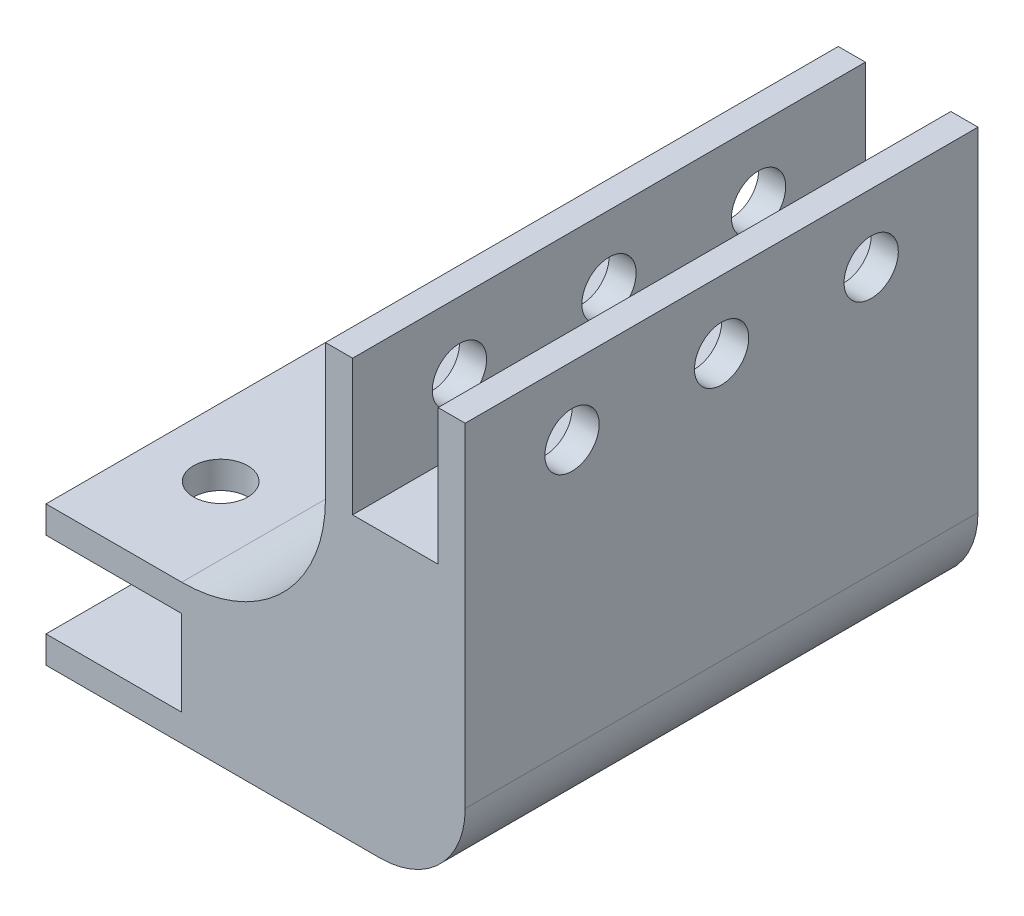
ISO-10303-21;
HEADER;
FILE_DESCRIPTION(('STEP AP214'),'2;1');
FILE_NAME('part.step','',(''),(''),'','','');
FILE_SCHEMA(('AUTOMOTIVE_DESIGN { 1 0 10303 214 1 1 1 1 }'));
ENDSEC;
DATA;
#1=APPLICATION_CONTEXT('core data for automotive mechanical design processes');
#2=APPLICATION_PROTOCOL_DEFINITION('international standard','automotive_design',2000,#1);
#3=PRODUCT_CONTEXT('',#1,'mechanical');
#4=PRODUCT('Part','Part','',(#3));
#5=PRODUCT_RELATED_PRODUCT_CATEGORY('part','',(#4));
#6=PRODUCT_DEFINITION_FORMATION('','',#4);
#7=PRODUCT_DEFINITION_CONTEXT('part definition',#1,'design');
#8=PRODUCT_DEFINITION('design','',#6,#7);
#9=PRODUCT_DEFINITION_SHAPE('','',#8);
#10=(LENGTH_UNIT() NAMED_UNIT(*) SI_UNIT(.MILLI.,.METRE.));
#11=(NAMED_UNIT(*) PLANE_ANGLE_UNIT() SI_UNIT($,.RADIAN.));
#12=(NAMED_UNIT(*) SI_UNIT($,.STERADIAN.) SOLID_ANGLE_UNIT());
#13=UNCERTAINTY_MEASURE_WITH_UNIT(LENGTH_MEASURE(1.E-05),#10,'distance_accuracy_value','');
#14=(GEOMETRIC_REPRESENTATION_CONTEXT(3) GLOBAL_UNCERTAINTY_ASSIGNED_CONTEXT((#13)) GLOBAL_UNIT_ASSIGNED_CONTEXT((#10,
#11,#12)) REPRESENTATION_CONTEXT('',''));
#15=CARTESIAN_POINT('',(0.,0.,0.));
#16=DIRECTION('',(0.,0.,1.));
#17=DIRECTION('',(1.,0.,0.));
#18=AXIS2_PLACEMENT_3D('',#15,#16,#17);
#19=CARTESIAN_POINT('',(150.,0.,60.));
#20=DIRECTION('',(0.,0.,-1.));
#21=DIRECTION('',(-1.,0.,0.));
#22=AXIS2_PLACEMENT_3D('',#19,#20,#21);
#23=PLANE('',#22);
#24=DIRECTION('',(1.,0.,0.));
#25=VECTOR('',#24,1.);
#26=CARTESIAN_POINT('',(104.125,-3.175,60.));
#27=LINE('',#26,#25);
#28=CARTESIAN_POINT('',(104.125,-3.175,60.));
#29=VERTEX_POINT('',#28);
#30=CARTESIAN_POINT('',(143.175,-3.175,60.));
#31=VERTEX_POINT('',#30);
#32=EDGE_CURVE('E212',#29,#31,#27,.T.);
#33=ORIENTED_EDGE('',*,*,#32,.T.);
#34=CARTESIAN_POINT('',(143.175,6.825,60.));
#35=DIRECTION('',(0.,0.,-1.));
#36=DIRECTION('',(-1.,0.,0.));
#37=AXIS2_PLACEMENT_3D('',#34,#35,#36);
#38=CIRCLE('',#37,10.);
#39=CARTESIAN_POINT('',(153.175,6.82500000000003,60.));
#40=VERTEX_POINT('',#39);
#41=EDGE_CURVE('E12',#31,#40,#38,.F.);
#42=ORIENTED_EDGE('',*,*,#41,.T.);
#43=DIRECTION('',(0.,1.,0.));
#44=VECTOR('',#43,1.);
#45=CARTESIAN_POINT('',(153.175,45.875,60.));
#46=LINE('',#45,#44);
#47=CARTESIAN_POINT('',(153.175,45.875,60.));
#48=VERTEX_POINT('',#47);
#49=EDGE_CURVE('E215',#40,#48,#46,.T.);
#50=ORIENTED_EDGE('',*,*,#49,.T.);
#51=DIRECTION('',(-1.,0.,0.));
#52=VECTOR('',#51,1.);
#53=CARTESIAN_POINT('',(150.,45.875,60.));
#54=LINE('',#53,#52);
#55=CARTESIAN_POINT('',(150.,45.875,60.));
#56=VERTEX_POINT('',#55);
#57=EDGE_CURVE('E189',#48,#56,#54,.T.);
#58=ORIENTED_EDGE('',*,*,#57,.T.);
#59=DIRECTION('',(0.,-1.,0.));
#60=VECTOR('',#59,1.);
#61=CARTESIAN_POINT('',(150.,30.,60.));
#62=LINE('',#61,#60);
#63=CARTESIAN_POINT('',(150.,30.,60.));
#64=VERTEX_POINT('',#63);
#65=EDGE_CURVE('E185',#56,#64,#62,.T.);
#66=ORIENTED_EDGE('',*,*,#65,.T.);
#67=DIRECTION('',(1.,0.,0.));
#68=VECTOR('',#67,1.);
#69=CARTESIAN_POINT('',(150.,30.,60.));
#70=LINE('',#69,#68);
#71=CARTESIAN_POINT('',(140.,30.,60.));
#72=VERTEX_POINT('',#71);
#73=EDGE_CURVE('E307',#72,#64,#70,.T.);
#74=ORIENTED_EDGE('',*,*,#73,.F.);
#75=DIRECTION('',(0.,1.,0.));
#76=VECTOR('',#75,1.);
#77=CARTESIAN_POINT('',(140.,45.875,60.));
#78=LINE('',#77,#76);
#79=CARTESIAN_POINT('',(140.,45.875,60.));
#80=VERTEX_POINT('',#79);
#81=EDGE_CURVE('E224',#72,#80,#78,.T.);
#82=ORIENTED_EDGE('',*,*,#81,.T.);
#83=DIRECTION('',(-1.,0.,0.));
#84=VECTOR('',#83,1.);
#85=CARTESIAN_POINT('',(136.825,45.875,60.));
#86=LINE('',#85,#84);
#87=CARTESIAN_POINT('',(136.825,45.875,60.));
#88=VERTEX_POINT('',#87);
#89=EDGE_CURVE('E263',#80,#88,#86,.T.);
#90=ORIENTED_EDGE('',*,*,#89,.T.);
#91=DIRECTION('',(0.,-1.,0.));
#92=VECTOR('',#91,1.);
#93=CARTESIAN_POINT('',(136.825,30.,60.));
#94=LINE('',#93,#92);
#95=CARTESIAN_POINT('',(136.825,30.,60.));
#96=VERTEX_POINT('',#95);
#97=EDGE_CURVE('E267',#88,#96,#94,.T.);
#98=ORIENTED_EDGE('',*,*,#97,.T.);
#99=CARTESIAN_POINT('',(120.,30.,60.));
#100=DIRECTION('',(0.,0.,-1.));
#101=DIRECTION('',(1.,0.,0.));
#102=AXIS2_PLACEMENT_3D('',#99,#100,#101);
#103=CIRCLE('',#102,16.825);
#104=CARTESIAN_POINT('',(120.,13.175,60.));
#105=VERTEX_POINT('',#104);
#106=EDGE_CURVE('E271',#96,#105,#103,.T.);
#107=ORIENTED_EDGE('',*,*,#106,.T.);
#108=DIRECTION('',(-1.,0.,0.));
#109=VECTOR('',#108,1.);
#110=CARTESIAN_POINT('',(120.,13.175,60.));
#111=LINE('',#110,#109);
#112=CARTESIAN_POINT('',(104.125,13.175,60.));
#113=VERTEX_POINT('',#112);
#114=EDGE_CURVE('E275',#105,#113,#111,.T.);
#115=ORIENTED_EDGE('',*,*,#114,.T.);
#116=DIRECTION('',(0.,-1.,0.));
#117=VECTOR('',#116,1.);
#118=CARTESIAN_POINT('',(104.125,13.175,60.));
#119=LINE('',#118,#117);
#120=CARTESIAN_POINT('',(104.125,10.,60.));
#121=VERTEX_POINT('',#120);
#122=EDGE_CURVE('E279',#113,#121,#119,.T.);
#123=ORIENTED_EDGE('',*,*,#122,.T.);
#124=DIRECTION('',(1.,0.,0.));
#125=VECTOR('',#124,1.);
#126=CARTESIAN_POINT('',(104.125,10.,60.));
#127=LINE('',#126,#125);
#128=CARTESIAN_POINT('',(120.,10.,60.));
#129=VERTEX_POINT('',#128);
#130=EDGE_CURVE('E236',#121,#129,#127,.T.);
#131=ORIENTED_EDGE('',*,*,#130,.T.);
#132=DIRECTION('',(0.,-1.,0.));
#133=VECTOR('',#132,1.);
#134=CARTESIAN_POINT('',(120.,0.,60.));
#135=LINE('',#134,#133);
#136=CARTESIAN_POINT('',(120.,0.,60.));
#137=VERTEX_POINT('',#136);
#138=EDGE_CURVE('E310',#129,#137,#135,.T.);
#139=ORIENTED_EDGE('',*,*,#138,.T.);
#140=DIRECTION('',(-1.,0.,0.));
#141=VECTOR('',#140,1.);
#142=CARTESIAN_POINT('',(120.,0.,60.));
#143=LINE('',#142,#141);
#144=CARTESIAN_POINT('',(104.125,0.,60.));
#145=VERTEX_POINT('',#144);
#146=EDGE_CURVE('E207',#137,#145,#143,.T.);
#147=ORIENTED_EDGE('',*,*,#146,.T.);
#148=DIRECTION('',(0.,-1.,0.));
#149=VECTOR('',#148,1.);
#150=CARTESIAN_POINT('',(104.125,0.,60.));
#151=LINE('',#150,#149);
#152=EDGE_CURVE('E165',#145,#29,#151,.T.);
#153=ORIENTED_EDGE('',*,*,#152,.T.);
#154=EDGE_LOOP('',(#33,#42,#50,#58,#66,#74,#82,#90,#98,#107,#115,#123,#131,#139,#147,#153));
#155=FACE_BOUND('',#154,.T.);
#156=ADVANCED_FACE('F46',(#155),#23,.F.);
#157=CARTESIAN_POINT('',(150.,0.,0.));
#158=DIRECTION('',(0.,0.,-1.));
#159=DIRECTION('',(-1.,0.,0.));
#160=AXIS2_PLACEMENT_3D('',#157,#158,#159);
#161=PLANE('',#160);
#162=DIRECTION('',(0.,1.,0.));
#163=VECTOR('',#162,1.);
#164=CARTESIAN_POINT('',(153.175,45.875,0.));
#165=LINE('',#164,#163);
#166=CARTESIAN_POINT('',(153.175,6.82500000000003,0.));
#167=VERTEX_POINT('',#166);
#168=CARTESIAN_POINT('',(153.175,45.875,0.));
#169=VERTEX_POINT('',#168);
#170=EDGE_CURVE('E197',#167,#169,#165,.T.);
#171=ORIENTED_EDGE('',*,*,#170,.F.);
#172=CARTESIAN_POINT('',(143.175,6.825,0.));
#173=DIRECTION('',(0.,0.,-1.));
#174=DIRECTION('',(-1.,0.,0.));
#175=AXIS2_PLACEMENT_3D('',#172,#173,#174);
#176=CIRCLE('',#175,10.);
#177=CARTESIAN_POINT('',(143.175,-3.175,0.));
#178=VERTEX_POINT('',#177);
#179=EDGE_CURVE('E69',#167,#178,#176,.T.);
#180=ORIENTED_EDGE('',*,*,#179,.T.);
#181=DIRECTION('',(1.,0.,0.));
#182=VECTOR('',#181,1.);
#183=CARTESIAN_POINT('',(104.125,-3.175,0.));
#184=LINE('',#183,#182);
#185=CARTESIAN_POINT('',(104.125,-3.175,0.));
#186=VERTEX_POINT('',#185);
#187=EDGE_CURVE('E178',#186,#178,#184,.T.);
#188=ORIENTED_EDGE('',*,*,#187,.F.);
#189=DIRECTION('',(0.,-1.,0.));
#190=VECTOR('',#189,1.);
#191=CARTESIAN_POINT('',(104.125,0.,0.));
#192=LINE('',#191,#190);
#193=CARTESIAN_POINT('',(104.125,0.,0.));
#194=VERTEX_POINT('',#193);
#195=EDGE_CURVE('E163',#194,#186,#192,.T.);
#196=ORIENTED_EDGE('',*,*,#195,.F.);
#197=DIRECTION('',(-1.,0.,0.));
#198=VECTOR('',#197,1.);
#199=CARTESIAN_POINT('',(120.,0.,0.));
#200=LINE('',#199,#198);
#201=CARTESIAN_POINT('',(120.,0.,0.));
#202=VERTEX_POINT('',#201);
#203=EDGE_CURVE('E177',#202,#194,#200,.T.);
#204=ORIENTED_EDGE('',*,*,#203,.F.);
#205=DIRECTION('',(0.,-1.,0.));
#206=VECTOR('',#205,1.);
#207=CARTESIAN_POINT('',(120.,0.,0.));
#208=LINE('',#207,#206);
#209=CARTESIAN_POINT('',(120.,10.,0.));
#210=VERTEX_POINT('',#209);
#211=EDGE_CURVE('E320',#210,#202,#208,.T.);
#212=ORIENTED_EDGE('',*,*,#211,.F.);
#213=DIRECTION('',(1.,0.,0.));
#214=VECTOR('',#213,1.);
#215=CARTESIAN_POINT('',(104.125,10.,0.));
#216=LINE('',#215,#214);
#217=CARTESIAN_POINT('',(104.125,10.,0.));
#218=VERTEX_POINT('',#217);
#219=EDGE_CURVE('E256',#218,#210,#216,.T.);
#220=ORIENTED_EDGE('',*,*,#219,.F.);
#221=DIRECTION('',(0.,-1.,0.));
#222=VECTOR('',#221,1.);
#223=CARTESIAN_POINT('',(104.125,13.175,0.));
#224=LINE('',#223,#222);
#225=CARTESIAN_POINT('',(104.125,13.175,0.));
#226=VERTEX_POINT('',#225);
#227=EDGE_CURVE('E252',#226,#218,#224,.T.);
#228=ORIENTED_EDGE('',*,*,#227,.F.);
#229=DIRECTION('',(-1.,0.,0.));
#230=VECTOR('',#229,1.);
#231=CARTESIAN_POINT('',(120.,13.175,0.));
#232=LINE('',#231,#230);
#233=CARTESIAN_POINT('',(120.,13.175,0.));
#234=VERTEX_POINT('',#233);
#235=EDGE_CURVE('E248',#234,#226,#232,.T.);
#236=ORIENTED_EDGE('',*,*,#235,.F.);
#237=CARTESIAN_POINT('',(120.,30.,0.));
#238=DIRECTION('',(0.,0.,-1.));
#239=DIRECTION('',(1.,0.,0.));
#240=AXIS2_PLACEMENT_3D('',#237,#238,#239);
#241=CIRCLE('',#240,16.825);
#242=CARTESIAN_POINT('',(136.825,30.,0.));
#243=VERTEX_POINT('',#242);
#244=EDGE_CURVE('E244',#243,#234,#241,.T.);
#245=ORIENTED_EDGE('',*,*,#244,.F.);
#246=DIRECTION('',(0.,-1.,0.));
#247=VECTOR('',#246,1.);
#248=CARTESIAN_POINT('',(136.825,30.,0.));
#249=LINE('',#248,#247);
#250=CARTESIAN_POINT('',(136.825,45.875,0.));
#251=VERTEX_POINT('',#250);
#252=EDGE_CURVE('E240',#251,#243,#249,.T.);
#253=ORIENTED_EDGE('',*,*,#252,.F.);
#254=DIRECTION('',(-1.,0.,0.));
#255=VECTOR('',#254,1.);
#256=CARTESIAN_POINT('',(136.825,45.875,0.));
#257=LINE('',#256,#255);
#258=CARTESIAN_POINT('',(140.,45.875,0.));
#259=VERTEX_POINT('',#258);
#260=EDGE_CURVE('E235',#259,#251,#257,.T.);
#261=ORIENTED_EDGE('',*,*,#260,.F.);
#262=DIRECTION('',(0.,1.,0.));
#263=VECTOR('',#262,1.);
#264=CARTESIAN_POINT('',(140.,45.875,0.));
#265=LINE('',#264,#263);
#266=CARTESIAN_POINT('',(140.,30.,0.));
#267=VERTEX_POINT('',#266);
#268=EDGE_CURVE('E231',#267,#259,#265,.T.);
#269=ORIENTED_EDGE('',*,*,#268,.F.);
#270=DIRECTION('',(1.,0.,0.));
#271=VECTOR('',#270,1.);
#272=CARTESIAN_POINT('',(150.,30.,0.));
#273=LINE('',#272,#271);
#274=CARTESIAN_POINT('',(150.,30.,0.));
#275=VERTEX_POINT('',#274);
#276=EDGE_CURVE('E289',#267,#275,#273,.T.);
#277=ORIENTED_EDGE('',*,*,#276,.T.);
#278=DIRECTION('',(0.,-1.,0.));
#279=VECTOR('',#278,1.);
#280=CARTESIAN_POINT('',(150.,30.,0.));
#281=LINE('',#280,#279);
#282=CARTESIAN_POINT('',(150.,45.875,0.));
#283=VERTEX_POINT('',#282);
#284=EDGE_CURVE('E172',#283,#275,#281,.T.);
#285=ORIENTED_EDGE('',*,*,#284,.F.);
#286=DIRECTION('',(-1.,0.,0.));
#287=VECTOR('',#286,1.);
#288=CARTESIAN_POINT('',(150.,45.875,0.));
#289=LINE('',#288,#287);
#290=EDGE_CURVE('E200',#169,#283,#289,.T.);
#291=ORIENTED_EDGE('',*,*,#290,.F.);
#292=EDGE_LOOP('',(#171,#180,#188,#196,#204,#212,#220,#228,#236,#245,#253,#261,#269,#277,#285,#291));
#293=FACE_BOUND('',#292,.T.);
#294=ADVANCED_FACE('F175',(#293),#161,.T.);
#295=CARTESIAN_POINT('',(120.,0.,0.));
#296=DIRECTION('',(1.,0.,0.));
#297=DIRECTION('',(0.,0.,-1.));
#298=AXIS2_PLACEMENT_3D('',#295,#296,#297);
#299=PLANE('',#298);
#300=DIRECTION('',(0.,0.,1.));
#301=VECTOR('',#300,1.);
#302=CARTESIAN_POINT('',(120.,10.,0.));
#303=LINE('',#302,#301);
#304=EDGE_CURVE('E314',#129,#210,#303,.F.);
#305=ORIENTED_EDGE('',*,*,#304,.T.);
#306=ORIENTED_EDGE('',*,*,#211,.T.);
#307=DIRECTION('',(0.,0.,1.));
#308=VECTOR('',#307,1.);
#309=CARTESIAN_POINT('',(120.,0.,0.));
#310=LINE('',#309,#308);
#311=EDGE_CURVE('E183',#137,#202,#310,.F.);
#312=ORIENTED_EDGE('',*,*,#311,.F.);
#313=ORIENTED_EDGE('',*,*,#138,.F.);
#314=EDGE_LOOP('',(#305,#306,#312,#313));
#315=FACE_BOUND('',#314,.T.);
#316=ADVANCED_FACE('F448',(#315),#299,.F.);
#317=CARTESIAN_POINT('',(0.,30.,0.));
#318=DIRECTION('',(0.,1.,0.));
#319=DIRECTION('',(0.,0.,1.));
#320=AXIS2_PLACEMENT_3D('',#317,#318,#319);
#321=PLANE('',#320);
#322=ORIENTED_EDGE('',*,*,#73,.T.);
#323=DIRECTION('',(0.,0.,1.));
#324=VECTOR('',#323,1.);
#325=CARTESIAN_POINT('',(150.,30.,0.));
#326=LINE('',#325,#324);
#327=EDGE_CURVE('E315',#275,#64,#326,.T.);
#328=ORIENTED_EDGE('',*,*,#327,.F.);
#329=ORIENTED_EDGE('',*,*,#276,.F.);
#330=DIRECTION('',(0.,0.,1.));
#331=VECTOR('',#330,1.);
#332=CARTESIAN_POINT('',(140.,30.,0.));
#333=LINE('',#332,#331);
#334=EDGE_CURVE('E366',#267,#72,#333,.T.);
#335=ORIENTED_EDGE('',*,*,#334,.T.);
#336=EDGE_LOOP('',(#322,#328,#329,#335));
#337=FACE_BOUND('',#336,.T.);
#338=ADVANCED_FACE('F418',(#337),#321,.T.);
#339=CARTESIAN_POINT('',(104.125,10.,0.));
#340=DIRECTION('',(0.,-1.,0.));
#341=DIRECTION('',(0.,0.,-1.));
#342=AXIS2_PLACEMENT_3D('',#339,#340,#341);
#343=PLANE('',#342);
#344=CARTESIAN_POINT('',(112.0625,9.99999999999999,12.5));
#345=DIRECTION('',(0.,-1.,0.));
#346=DIRECTION('',(0.,0.,-1.));
#347=AXIS2_PLACEMENT_3D('',#344,#345,#346);
#348=CIRCLE('',#347,3.175);
#349=CARTESIAN_POINT('',(112.0625,9.99999999999999,9.325));
#350=VERTEX_POINT('',#349);
#351=EDGE_CURVE('E799',#350,#350,#348,.T.);
#352=ORIENTED_EDGE('',*,*,#351,.F.);
#353=EDGE_LOOP('',(#352));
#354=FACE_BOUND('',#353,.T.);
#355=CARTESIAN_POINT('',(112.0625,9.99999999999999,30.));
#356=DIRECTION('',(0.,-1.,0.));
#357=DIRECTION('',(0.,0.,-1.));
#358=AXIS2_PLACEMENT_3D('',#355,#356,#357);
#359=CIRCLE('',#358,3.175);
#360=CARTESIAN_POINT('',(112.0625,9.99999999999999,26.825));
#361=VERTEX_POINT('',#360);
#362=EDGE_CURVE('E393',#361,#361,#359,.T.);
#363=ORIENTED_EDGE('',*,*,#362,.F.);
#364=EDGE_LOOP('',(#363));
#365=FACE_BOUND('',#364,.T.);
#366=CARTESIAN_POINT('',(112.0625,9.99999999999999,47.5));
#367=DIRECTION('',(0.,-1.,0.));
#368=DIRECTION('',(0.,0.,-1.));
#369=AXIS2_PLACEMENT_3D('',#366,#367,#368);
#370=CIRCLE('',#369,3.175);
#371=CARTESIAN_POINT('',(112.0625,9.99999999999999,44.325));
#372=VERTEX_POINT('',#371);
#373=EDGE_CURVE('E387',#372,#372,#370,.T.);
#374=ORIENTED_EDGE('',*,*,#373,.F.);
#375=EDGE_LOOP('',(#374));
#376=FACE_BOUND('',#375,.T.);
#377=ORIENTED_EDGE('',*,*,#130,.F.);
#378=DIRECTION('',(0.,0.,1.));
#379=VECTOR('',#378,1.);
#380=CARTESIAN_POINT('',(104.125,10.,0.));
#381=LINE('',#380,#379);
#382=EDGE_CURVE('E286',#218,#121,#381,.T.);
#383=ORIENTED_EDGE('',*,*,#382,.F.);
#384=ORIENTED_EDGE('',*,*,#219,.T.);
#385=ORIENTED_EDGE('',*,*,#304,.F.);
#386=EDGE_LOOP('',(#377,#383,#384,#385));
#387=FACE_BOUND('',#386,.T.);
#388=ADVANCED_FACE('F445',(#354,#365,#376,#387),#343,.T.);
#389=CARTESIAN_POINT('',(104.125,13.175,0.));
#390=DIRECTION('',(-1.,0.,0.));
#391=DIRECTION('',(0.,0.,1.));
#392=AXIS2_PLACEMENT_3D('',#389,#390,#391);
#393=PLANE('',#392);
#394=ORIENTED_EDGE('',*,*,#122,.F.);
#395=DIRECTION('',(0.,0.,1.));
#396=VECTOR('',#395,1.);
#397=CARTESIAN_POINT('',(104.125,13.175,0.));
#398=LINE('',#397,#396);
#399=EDGE_CURVE('E290',#226,#113,#398,.T.);
#400=ORIENTED_EDGE('',*,*,#399,.F.);
#401=ORIENTED_EDGE('',*,*,#227,.T.);
#402=ORIENTED_EDGE('',*,*,#382,.T.);
#403=EDGE_LOOP('',(#394,#400,#401,#402));
#404=FACE_BOUND('',#403,.T.);
#405=ADVANCED_FACE('F442',(#404),#393,.T.);
#406=CARTESIAN_POINT('',(120.,13.175,0.));
#407=DIRECTION('',(0.,1.,0.));
#408=DIRECTION('',(-1.,0.,0.));
#409=AXIS2_PLACEMENT_3D('',#406,#407,#408);
#410=PLANE('',#409);
#411=CARTESIAN_POINT('',(112.0625,13.175,12.5));
#412=DIRECTION('',(0.,1.,0.));
#413=DIRECTION('',(-1.,0.,0.));
#414=AXIS2_PLACEMENT_3D('',#411,#412,#413);
#415=CIRCLE('',#414,3.175);
#416=CARTESIAN_POINT('',(108.8875,13.175,12.5));
#417=VERTEX_POINT('',#416);
#418=EDGE_CURVE('E392',#417,#417,#415,.T.);
#419=ORIENTED_EDGE('',*,*,#418,.F.);
#420=EDGE_LOOP('',(#419));
#421=FACE_BOUND('',#420,.T.);
#422=CARTESIAN_POINT('',(112.0625,13.175,30.));
#423=DIRECTION('',(0.,1.,0.));
#424=DIRECTION('',(-1.,0.,0.));
#425=AXIS2_PLACEMENT_3D('',#422,#423,#424);
#426=CIRCLE('',#425,3.175);
#427=CARTESIAN_POINT('',(108.8875,13.175,30.));
#428=VERTEX_POINT('',#427);
#429=EDGE_CURVE('E386',#428,#428,#426,.T.);
#430=ORIENTED_EDGE('',*,*,#429,.F.);
#431=EDGE_LOOP('',(#430));
#432=FACE_BOUND('',#431,.T.);
#433=CARTESIAN_POINT('',(112.0625,13.175,47.5));
#434=DIRECTION('',(0.,1.,0.));
#435=DIRECTION('',(-1.,0.,0.));
#436=AXIS2_PLACEMENT_3D('',#433,#434,#435);
#437=CIRCLE('',#436,3.175);
#438=CARTESIAN_POINT('',(108.8875,13.175,47.5));
#439=VERTEX_POINT('',#438);
#440=EDGE_CURVE('E380',#439,#439,#437,.T.);
#441=ORIENTED_EDGE('',*,*,#440,.F.);
#442=EDGE_LOOP('',(#441));
#443=FACE_BOUND('',#442,.T.);
#444=ORIENTED_EDGE('',*,*,#114,.F.);
#445=DIRECTION('',(0.,0.,1.));
#446=VECTOR('',#445,1.);
#447=CARTESIAN_POINT('',(120.,13.175,0.));
#448=LINE('',#447,#446);
#449=EDGE_CURVE('E293',#234,#105,#448,.T.);
#450=ORIENTED_EDGE('',*,*,#449,.F.);
#451=ORIENTED_EDGE('',*,*,#235,.T.);
#452=ORIENTED_EDGE('',*,*,#399,.T.);
#453=EDGE_LOOP('',(#444,#450,#451,#452));
#454=FACE_BOUND('',#453,.T.);
#455=ADVANCED_FACE('F438',(#421,#432,#443,#454),#410,.T.);
#456=CARTESIAN_POINT('',(120.,30.,0.));
#457=DIRECTION('',(0.,0.,1.));
#458=DIRECTION('',(1.,0.,0.));
#459=AXIS2_PLACEMENT_3D('',#456,#457,#458);
#460=CYLINDRICAL_SURFACE('',#459,16.825);
#461=ORIENTED_EDGE('',*,*,#106,.F.);
#462=DIRECTION('',(0.,0.,1.));
#463=VECTOR('',#462,1.);
#464=CARTESIAN_POINT('',(136.825,30.,0.));
#465=LINE('',#464,#463);
#466=EDGE_CURVE('E296',#243,#96,#465,.T.);
#467=ORIENTED_EDGE('',*,*,#466,.F.);
#468=ORIENTED_EDGE('',*,*,#244,.T.);
#469=ORIENTED_EDGE('',*,*,#449,.T.);
#470=EDGE_LOOP('',(#461,#467,#468,#469));
#471=FACE_BOUND('',#470,.T.);
#472=ADVANCED_FACE('F433',(#471),#460,.F.);
#473=CARTESIAN_POINT('',(136.825,30.,0.));
#474=DIRECTION('',(-1.,0.,0.));
#475=DIRECTION('',(0.,0.,1.));
#476=AXIS2_PLACEMENT_3D('',#473,#474,#475);
#477=PLANE('',#476);
#478=CARTESIAN_POINT('',(136.825,37.9375,47.5));
#479=DIRECTION('',(-1.,0.,0.));
#480=DIRECTION('',(0.,0.,1.));
#481=AXIS2_PLACEMENT_3D('',#478,#479,#480);
#482=CIRCLE('',#481,3.175);
#483=CARTESIAN_POINT('',(136.825,37.9375,50.675));
#484=VERTEX_POINT('',#483);
#485=EDGE_CURVE('E192',#484,#484,#482,.T.);
#486=ORIENTED_EDGE('',*,*,#485,.F.);
#487=EDGE_LOOP('',(#486));
#488=FACE_BOUND('',#487,.T.);
#489=CARTESIAN_POINT('',(136.825,37.9375,12.5));
#490=DIRECTION('',(-1.,0.,0.));
#491=DIRECTION('',(0.,0.,1.));
#492=AXIS2_PLACEMENT_3D('',#489,#490,#491);
#493=CIRCLE('',#492,3.175);
#494=CARTESIAN_POINT('',(136.825,37.9375,15.675));
#495=VERTEX_POINT('',#494);
#496=EDGE_CURVE('E854',#495,#495,#493,.T.);
#497=ORIENTED_EDGE('',*,*,#496,.F.);
#498=EDGE_LOOP('',(#497));
#499=FACE_BOUND('',#498,.T.);
#500=CARTESIAN_POINT('',(136.825,37.9375,30.));
#501=DIRECTION('',(-1.,0.,0.));
#502=DIRECTION('',(0.,0.,1.));
#503=AXIS2_PLACEMENT_3D('',#500,#501,#502);
#504=CIRCLE('',#503,3.175);
#505=CARTESIAN_POINT('',(136.825,37.9375,33.175));
#506=VERTEX_POINT('',#505);
#507=EDGE_CURVE('E842',#506,#506,#504,.T.);
#508=ORIENTED_EDGE('',*,*,#507,.F.);
#509=EDGE_LOOP('',(#508));
#510=FACE_BOUND('',#509,.T.);
#511=ORIENTED_EDGE('',*,*,#97,.F.);
#512=DIRECTION('',(0.,0.,1.));
#513=VECTOR('',#512,1.);
#514=CARTESIAN_POINT('',(136.825,45.875,0.));
#515=LINE('',#514,#513);
#516=EDGE_CURVE('E299',#251,#88,#515,.T.);
#517=ORIENTED_EDGE('',*,*,#516,.F.);
#518=ORIENTED_EDGE('',*,*,#252,.T.);
#519=ORIENTED_EDGE('',*,*,#466,.T.);
#520=EDGE_LOOP('',(#511,#517,#518,#519));
#521=FACE_BOUND('',#520,.T.);
#522=ADVANCED_FACE('F429',(#488,#499,#510,#521),#477,.T.);
#523=CARTESIAN_POINT('',(136.825,45.875,0.));
#524=DIRECTION('',(0.,1.,0.));
#525=DIRECTION('',(0.,0.,1.));
#526=AXIS2_PLACEMENT_3D('',#523,#524,#525);
#527=PLANE('',#526);
#528=ORIENTED_EDGE('',*,*,#89,.F.);
#529=DIRECTION('',(0.,0.,1.));
#530=VECTOR('',#529,1.);
#531=CARTESIAN_POINT('',(140.,45.875,0.));
#532=LINE('',#531,#530);
#533=EDGE_CURVE('E259',#259,#80,#532,.T.);
#534=ORIENTED_EDGE('',*,*,#533,.F.);
#535=ORIENTED_EDGE('',*,*,#260,.T.);
#536=ORIENTED_EDGE('',*,*,#516,.T.);
#537=EDGE_LOOP('',(#528,#534,#535,#536));
#538=FACE_BOUND('',#537,.T.);
#539=ADVANCED_FACE('F427',(#538),#527,.T.);
#540=CARTESIAN_POINT('',(140.,45.875,0.));
#541=DIRECTION('',(1.,0.,0.));
#542=DIRECTION('',(0.,0.,-1.));
#543=AXIS2_PLACEMENT_3D('',#540,#541,#542);
#544=PLANE('',#543);
#545=CARTESIAN_POINT('',(140.,37.9375,47.5));
#546=DIRECTION('',(1.,0.,0.));
#547=DIRECTION('',(0.,0.,-1.));
#548=AXIS2_PLACEMENT_3D('',#545,#546,#547);
#549=CIRCLE('',#548,3.175);
#550=CARTESIAN_POINT('',(140.,37.9375,44.325));
#551=VERTEX_POINT('',#550);
#552=EDGE_CURVE('E861',#551,#551,#549,.T.);
#553=ORIENTED_EDGE('',*,*,#552,.F.);
#554=EDGE_LOOP('',(#553));
#555=FACE_BOUND('',#554,.T.);
#556=CARTESIAN_POINT('',(140.,37.9375,12.5));
#557=DIRECTION('',(1.,0.,0.));
#558=DIRECTION('',(0.,0.,-1.));
#559=AXIS2_PLACEMENT_3D('',#556,#557,#558);
#560=CIRCLE('',#559,3.175);
#561=CARTESIAN_POINT('',(140.,37.9375,9.325));
#562=VERTEX_POINT('',#561);
#563=EDGE_CURVE('E850',#562,#562,#560,.T.);
#564=ORIENTED_EDGE('',*,*,#563,.F.);
#565=EDGE_LOOP('',(#564));
#566=FACE_BOUND('',#565,.T.);
#567=CARTESIAN_POINT('',(140.,37.9375,30.));
#568=DIRECTION('',(1.,0.,0.));
#569=DIRECTION('',(0.,0.,-1.));
#570=AXIS2_PLACEMENT_3D('',#567,#568,#569);
#571=CIRCLE('',#570,3.175);
#572=CARTESIAN_POINT('',(140.,37.9375,26.825));
#573=VERTEX_POINT('',#572);
#574=EDGE_CURVE('E838',#573,#573,#571,.T.);
#575=ORIENTED_EDGE('',*,*,#574,.F.);
#576=EDGE_LOOP('',(#575));
#577=FACE_BOUND('',#576,.T.);
#578=ORIENTED_EDGE('',*,*,#81,.F.);
#579=ORIENTED_EDGE('',*,*,#334,.F.);
#580=ORIENTED_EDGE('',*,*,#268,.T.);
#581=ORIENTED_EDGE('',*,*,#533,.T.);
#582=EDGE_LOOP('',(#578,#579,#580,#581));
#583=FACE_BOUND('',#582,.T.);
#584=ADVANCED_FACE('F423',(#555,#566,#577,#583),#544,.T.);
#585=CARTESIAN_POINT('',(150.,30.,0.));
#586=DIRECTION('',(-1.,0.,0.));
#587=DIRECTION('',(0.,0.,1.));
#588=AXIS2_PLACEMENT_3D('',#585,#586,#587);
#589=PLANE('',#588);
#590=CARTESIAN_POINT('',(150.,37.9375,47.5));
#591=DIRECTION('',(-1.,0.,0.));
#592=DIRECTION('',(0.,0.,1.));
#593=AXIS2_PLACEMENT_3D('',#590,#591,#592);
#594=CIRCLE('',#593,3.175);
#595=CARTESIAN_POINT('',(150.,37.9375,50.675));
#596=VERTEX_POINT('',#595);
#597=EDGE_CURVE('E858',#596,#596,#594,.T.);
#598=ORIENTED_EDGE('',*,*,#597,.F.);
#599=EDGE_LOOP('',(#598));
#600=FACE_BOUND('',#599,.T.);
#601=CARTESIAN_POINT('',(150.,37.9375,12.5));
#602=DIRECTION('',(-1.,0.,0.));
#603=DIRECTION('',(0.,0.,1.));
#604=AXIS2_PLACEMENT_3D('',#601,#602,#603);
#605=CIRCLE('',#604,3.175);
#606=CARTESIAN_POINT('',(150.,37.9375,15.675));
#607=VERTEX_POINT('',#606);
#608=EDGE_CURVE('E846',#607,#607,#605,.T.);
#609=ORIENTED_EDGE('',*,*,#608,.F.);
#610=EDGE_LOOP('',(#609));
#611=FACE_BOUND('',#610,.T.);
#612=CARTESIAN_POINT('',(150.,37.9375,30.));
#613=DIRECTION('',(-1.,0.,0.));
#614=DIRECTION('',(0.,0.,1.));
#615=AXIS2_PLACEMENT_3D('',#612,#613,#614);
#616=CIRCLE('',#615,3.175);
#617=CARTESIAN_POINT('',(150.,37.9375,33.175));
#618=VERTEX_POINT('',#617);
#619=EDGE_CURVE('E834',#618,#618,#616,.T.);
#620=ORIENTED_EDGE('',*,*,#619,.F.);
#621=EDGE_LOOP('',(#620));
#622=FACE_BOUND('',#621,.T.);
#623=ORIENTED_EDGE('',*,*,#65,.F.);
#624=DIRECTION('',(0.,0.,1.));
#625=VECTOR('',#624,1.);
#626=CARTESIAN_POINT('',(150.,45.875,0.));
#627=LINE('',#626,#625);
#628=EDGE_CURVE('E221',#283,#56,#627,.T.);
#629=ORIENTED_EDGE('',*,*,#628,.F.);
#630=ORIENTED_EDGE('',*,*,#284,.T.);
#631=ORIENTED_EDGE('',*,*,#327,.T.);
#632=EDGE_LOOP('',(#623,#629,#630,#631));
#633=FACE_BOUND('',#632,.T.);
#634=ADVANCED_FACE('F415',(#600,#611,#622,#633),#589,.T.);
#635=CARTESIAN_POINT('',(150.,45.875,0.));
#636=DIRECTION('',(0.,1.,0.));
#637=DIRECTION('',(0.,0.,1.));
#638=AXIS2_PLACEMENT_3D('',#635,#636,#637);
#639=PLANE('',#638);
#640=ORIENTED_EDGE('',*,*,#57,.F.);
#641=DIRECTION('',(0.,0.,1.));
#642=VECTOR('',#641,1.);
#643=CARTESIAN_POINT('',(153.175,45.875,0.));
#644=LINE('',#643,#642);
#645=EDGE_CURVE('E225',#169,#48,#644,.T.);
#646=ORIENTED_EDGE('',*,*,#645,.F.);
#647=ORIENTED_EDGE('',*,*,#290,.T.);
#648=ORIENTED_EDGE('',*,*,#628,.T.);
#649=EDGE_LOOP('',(#640,#646,#647,#648));
#650=FACE_BOUND('',#649,.T.);
#651=ADVANCED_FACE('F410',(#650),#639,.T.);
#652=CARTESIAN_POINT('',(153.175,45.875,0.));
#653=DIRECTION('',(1.,0.,0.));
#654=DIRECTION('',(0.,1.,0.));
#655=AXIS2_PLACEMENT_3D('',#652,#653,#654);
#656=PLANE('',#655);
#657=CARTESIAN_POINT('',(153.175,37.9375,47.5));
#658=DIRECTION('',(1.,0.,0.));
#659=DIRECTION('',(0.,1.,0.));
#660=AXIS2_PLACEMENT_3D('',#657,#658,#659);
#661=CIRCLE('',#660,3.175);
#662=CARTESIAN_POINT('',(153.175,41.1125,47.5));
#663=VERTEX_POINT('',#662);
#664=EDGE_CURVE('E822',#663,#663,#661,.T.);
#665=ORIENTED_EDGE('',*,*,#664,.F.);
#666=EDGE_LOOP('',(#665));
#667=FACE_BOUND('',#666,.T.);
#668=CARTESIAN_POINT('',(153.175,37.9375,12.5));
#669=DIRECTION('',(1.,0.,0.));
#670=DIRECTION('',(0.,1.,0.));
#671=AXIS2_PLACEMENT_3D('',#668,#669,#670);
#672=CIRCLE('',#671,3.175);
#673=CARTESIAN_POINT('',(153.175,41.1125,12.5));
#674=VERTEX_POINT('',#673);
#675=EDGE_CURVE('E823',#674,#674,#672,.T.);
#676=ORIENTED_EDGE('',*,*,#675,.F.);
#677=EDGE_LOOP('',(#676));
#678=FACE_BOUND('',#677,.T.);
#679=CARTESIAN_POINT('',(153.175,37.9375,30.));
#680=DIRECTION('',(1.,0.,0.));
#681=DIRECTION('',(0.,1.,0.));
#682=AXIS2_PLACEMENT_3D('',#679,#680,#681);
#683=CIRCLE('',#682,3.175);
#684=CARTESIAN_POINT('',(153.175,41.1125,30.));
#685=VERTEX_POINT('',#684);
#686=EDGE_CURVE('E827',#685,#685,#683,.T.);
#687=ORIENTED_EDGE('',*,*,#686,.F.);
#688=EDGE_LOOP('',(#687));
#689=FACE_BOUND('',#688,.T.);
#690=ORIENTED_EDGE('',*,*,#49,.F.);
#691=DIRECTION('',(0.,0.,-1.));
#692=VECTOR('',#691,1.);
#693=CARTESIAN_POINT('',(153.175,6.82500000000003,0.));
#694=LINE('',#693,#692);
#695=EDGE_CURVE('E375',#40,#167,#694,.T.);
#696=ORIENTED_EDGE('',*,*,#695,.T.);
#697=ORIENTED_EDGE('',*,*,#170,.T.);
#698=ORIENTED_EDGE('',*,*,#645,.T.);
#699=EDGE_LOOP('',(#690,#696,#697,#698));
#700=FACE_BOUND('',#699,.T.);
#701=ADVANCED_FACE('F402',(#667,#678,#689,#700),#656,.T.);
#702=CARTESIAN_POINT('',(104.125,-3.175,0.));
#703=DIRECTION('',(0.,-1.,0.));
#704=DIRECTION('',(0.,0.,-1.));
#705=AXIS2_PLACEMENT_3D('',#702,#703,#704);
#706=PLANE('',#705);
#707=CARTESIAN_POINT('',(112.0625,-3.175,12.5));
#708=DIRECTION('',(0.,-1.,0.));
#709=DIRECTION('',(0.,0.,-1.));
#710=AXIS2_PLACEMENT_3D('',#707,#708,#709);
#711=CIRCLE('',#710,3.175);
#712=CARTESIAN_POINT('',(112.0625,-3.175,9.325));
#713=VERTEX_POINT('',#712);
#714=EDGE_CURVE('E381',#713,#713,#711,.T.);
#715=ORIENTED_EDGE('',*,*,#714,.F.);
#716=EDGE_LOOP('',(#715));
#717=FACE_BOUND('',#716,.T.);
#718=CARTESIAN_POINT('',(112.0625,-3.175,30.));
#719=DIRECTION('',(0.,-1.,0.));
#720=DIRECTION('',(0.,0.,-1.));
#721=AXIS2_PLACEMENT_3D('',#718,#719,#720);
#722=CIRCLE('',#721,3.175);
#723=CARTESIAN_POINT('',(112.0625,-3.175,26.825));
#724=VERTEX_POINT('',#723);
#725=EDGE_CURVE('E904',#724,#724,#722,.T.);
#726=ORIENTED_EDGE('',*,*,#725,.F.);
#727=EDGE_LOOP('',(#726));
#728=FACE_BOUND('',#727,.T.);
#729=CARTESIAN_POINT('',(112.0625,-3.175,47.5));
#730=DIRECTION('',(0.,-1.,0.));
#731=DIRECTION('',(0.,0.,-1.));
#732=AXIS2_PLACEMENT_3D('',#729,#730,#731);
#733=CIRCLE('',#732,3.175);
#734=CARTESIAN_POINT('',(112.0625,-3.175,44.325));
#735=VERTEX_POINT('',#734);
#736=EDGE_CURVE('E900',#735,#735,#733,.T.);
#737=ORIENTED_EDGE('',*,*,#736,.F.);
#738=EDGE_LOOP('',(#737));
#739=FACE_BOUND('',#738,.T.);
#740=ORIENTED_EDGE('',*,*,#187,.T.);
#741=DIRECTION('',(0.,0.,-1.));
#742=VECTOR('',#741,1.);
#743=CARTESIAN_POINT('',(143.175,-3.175,0.));
#744=LINE('',#743,#742);
#745=EDGE_CURVE('E55',#178,#31,#744,.F.);
#746=ORIENTED_EDGE('',*,*,#745,.T.);
#747=ORIENTED_EDGE('',*,*,#32,.F.);
#748=DIRECTION('',(0.,0.,1.));
#749=VECTOR('',#748,1.);
#750=CARTESIAN_POINT('',(104.125,-3.175,0.));
#751=LINE('',#750,#749);
#752=EDGE_CURVE('E171',#186,#29,#751,.T.);
#753=ORIENTED_EDGE('',*,*,#752,.F.);
#754=EDGE_LOOP('',(#740,#746,#747,#753));
#755=FACE_BOUND('',#754,.T.);
#756=ADVANCED_FACE('F475',(#717,#728,#739,#755),#706,.T.);
#757=CARTESIAN_POINT('',(104.125,0.,0.));
#758=DIRECTION('',(-1.,0.,0.));
#759=DIRECTION('',(0.,0.,1.));
#760=AXIS2_PLACEMENT_3D('',#757,#758,#759);
#761=PLANE('',#760);
#762=ORIENTED_EDGE('',*,*,#152,.F.);
#763=DIRECTION('',(0.,0.,1.));
#764=VECTOR('',#763,1.);
#765=CARTESIAN_POINT('',(104.125,0.,0.));
#766=LINE('',#765,#764);
#767=EDGE_CURVE('E160',#194,#145,#766,.T.);
#768=ORIENTED_EDGE('',*,*,#767,.F.);
#769=ORIENTED_EDGE('',*,*,#195,.T.);
#770=ORIENTED_EDGE('',*,*,#752,.T.);
#771=EDGE_LOOP('',(#762,#768,#769,#770));
#772=FACE_BOUND('',#771,.T.);
#773=ADVANCED_FACE('F162',(#772),#761,.T.);
#774=CARTESIAN_POINT('',(120.,0.,0.));
#775=DIRECTION('',(0.,1.,0.));
#776=DIRECTION('',(-1.,0.,0.));
#777=AXIS2_PLACEMENT_3D('',#774,#775,#776);
#778=PLANE('',#777);
#779=CARTESIAN_POINT('',(112.0625,0.,12.5));
#780=DIRECTION('',(0.,1.,0.));
#781=DIRECTION('',(-1.,0.,0.));
#782=AXIS2_PLACEMENT_3D('',#779,#780,#781);
#783=CIRCLE('',#782,3.175);
#784=CARTESIAN_POINT('',(108.8875,0.,12.5));
#785=VERTEX_POINT('',#784);
#786=EDGE_CURVE('E388',#785,#785,#783,.T.);
#787=ORIENTED_EDGE('',*,*,#786,.F.);
#788=EDGE_LOOP('',(#787));
#789=FACE_BOUND('',#788,.T.);
#790=CARTESIAN_POINT('',(112.0625,0.,30.));
#791=DIRECTION('',(0.,1.,0.));
#792=DIRECTION('',(-1.,0.,0.));
#793=AXIS2_PLACEMENT_3D('',#790,#791,#792);
#794=CIRCLE('',#793,3.175);
#795=CARTESIAN_POINT('',(108.8875,0.,30.));
#796=VERTEX_POINT('',#795);
#797=EDGE_CURVE('E382',#796,#796,#794,.T.);
#798=ORIENTED_EDGE('',*,*,#797,.F.);
#799=EDGE_LOOP('',(#798));
#800=FACE_BOUND('',#799,.T.);
#801=CARTESIAN_POINT('',(112.0625,0.,47.5));
#802=DIRECTION('',(0.,1.,0.));
#803=DIRECTION('',(-1.,0.,0.));
#804=AXIS2_PLACEMENT_3D('',#801,#802,#803);
#805=CIRCLE('',#804,3.175);
#806=CARTESIAN_POINT('',(108.8875,0.,47.5));
#807=VERTEX_POINT('',#806);
#808=EDGE_CURVE('E376',#807,#807,#805,.T.);
#809=ORIENTED_EDGE('',*,*,#808,.F.);
#810=EDGE_LOOP('',(#809));
#811=FACE_BOUND('',#810,.T.);
#812=ORIENTED_EDGE('',*,*,#146,.F.);
#813=ORIENTED_EDGE('',*,*,#311,.T.);
#814=ORIENTED_EDGE('',*,*,#203,.T.);
#815=ORIENTED_EDGE('',*,*,#767,.T.);
#816=EDGE_LOOP('',(#812,#813,#814,#815));
#817=FACE_BOUND('',#816,.T.);
#818=ADVANCED_FACE('F182',(#789,#800,#811,#817),#778,.T.);
#819=CARTESIAN_POINT('',(104.125,37.9374999999999,30.));
#820=DIRECTION('',(1.,0.,0.));
#821=DIRECTION('',(0.,1.,0.));
#822=AXIS2_PLACEMENT_3D('',#819,#820,#821);
#823=CYLINDRICAL_SURFACE('',#822,3.175);
#824=ORIENTED_EDGE('',*,*,#619,.T.);
#825=EDGE_LOOP('',(#824));
#826=FACE_BOUND('',#825,.T.);
#827=ORIENTED_EDGE('',*,*,#686,.T.);
#828=EDGE_LOOP('',(#827));
#829=FACE_BOUND('',#828,.T.);
#830=ADVANCED_FACE('F571',(#826,#829),#823,.F.);
#831=CARTESIAN_POINT('',(104.125,37.9374999999999,12.5));
#832=DIRECTION('',(1.,0.,0.));
#833=DIRECTION('',(0.,1.,0.));
#834=AXIS2_PLACEMENT_3D('',#831,#832,#833);
#835=CYLINDRICAL_SURFACE('',#834,3.175);
#836=ORIENTED_EDGE('',*,*,#608,.T.);
#837=EDGE_LOOP('',(#836));
#838=FACE_BOUND('',#837,.T.);
#839=ORIENTED_EDGE('',*,*,#675,.T.);
#840=EDGE_LOOP('',(#839));
#841=FACE_BOUND('',#840,.T.);
#842=ADVANCED_FACE('F563',(#838,#841),#835,.F.);
#843=CARTESIAN_POINT('',(104.125,37.9374999999999,47.5));
#844=DIRECTION('',(1.,0.,0.));
#845=DIRECTION('',(0.,1.,0.));
#846=AXIS2_PLACEMENT_3D('',#843,#844,#845);
#847=CYLINDRICAL_SURFACE('',#846,3.175);
#848=ORIENTED_EDGE('',*,*,#597,.T.);
#849=EDGE_LOOP('',(#848));
#850=FACE_BOUND('',#849,.T.);
#851=ORIENTED_EDGE('',*,*,#664,.T.);
#852=EDGE_LOOP('',(#851));
#853=FACE_BOUND('',#852,.T.);
#854=ADVANCED_FACE('F553',(#850,#853),#847,.F.);
#855=ORIENTED_EDGE('',*,*,#507,.T.);
#856=EDGE_LOOP('',(#855));
#857=FACE_BOUND('',#856,.T.);
#858=ORIENTED_EDGE('',*,*,#574,.T.);
#859=EDGE_LOOP('',(#858));
#860=FACE_BOUND('',#859,.T.);
#861=ADVANCED_FACE('F560',(#857,#860),#823,.F.);
#862=ORIENTED_EDGE('',*,*,#496,.T.);
#863=EDGE_LOOP('',(#862));
#864=FACE_BOUND('',#863,.T.);
#865=ORIENTED_EDGE('',*,*,#563,.T.);
#866=EDGE_LOOP('',(#865));
#867=FACE_BOUND('',#866,.T.);
#868=ADVANCED_FACE('F550',(#864,#867),#835,.F.);
#869=ORIENTED_EDGE('',*,*,#485,.T.);
#870=EDGE_LOOP('',(#869));
#871=FACE_BOUND('',#870,.T.);
#872=ORIENTED_EDGE('',*,*,#552,.T.);
#873=EDGE_LOOP('',(#872));
#874=FACE_BOUND('',#873,.T.);
#875=ADVANCED_FACE('F543',(#871,#874),#847,.F.);
#876=CARTESIAN_POINT('',(112.0625,45.875,47.5));
#877=DIRECTION('',(0.,-1.,0.));
#878=DIRECTION('',(0.,0.,-1.));
#879=AXIS2_PLACEMENT_3D('',#876,#877,#878);
#880=CYLINDRICAL_SURFACE('',#879,3.175);
#881=ORIENTED_EDGE('',*,*,#808,.T.);
#882=EDGE_LOOP('',(#881));
#883=FACE_BOUND('',#882,.T.);
#884=ORIENTED_EDGE('',*,*,#736,.T.);
#885=EDGE_LOOP('',(#884));
#886=FACE_BOUND('',#885,.T.);
#887=ADVANCED_FACE('F525',(#883,#886),#880,.F.);
#888=CARTESIAN_POINT('',(112.0625,45.875,30.));
#889=DIRECTION('',(0.,-1.,0.));
#890=DIRECTION('',(0.,0.,-1.));
#891=AXIS2_PLACEMENT_3D('',#888,#889,#890);
#892=CYLINDRICAL_SURFACE('',#891,3.175);
#893=ORIENTED_EDGE('',*,*,#797,.T.);
#894=EDGE_LOOP('',(#893));
#895=FACE_BOUND('',#894,.T.);
#896=ORIENTED_EDGE('',*,*,#725,.T.);
#897=EDGE_LOOP('',(#896));
#898=FACE_BOUND('',#897,.T.);
#899=ADVANCED_FACE('F517',(#895,#898),#892,.F.);
#900=CARTESIAN_POINT('',(112.0625,45.875,12.5));
#901=DIRECTION('',(0.,-1.,0.));
#902=DIRECTION('',(0.,0.,-1.));
#903=AXIS2_PLACEMENT_3D('',#900,#901,#902);
#904=CYLINDRICAL_SURFACE('',#903,3.175);
#905=ORIENTED_EDGE('',*,*,#786,.T.);
#906=EDGE_LOOP('',(#905));
#907=FACE_BOUND('',#906,.T.);
#908=ORIENTED_EDGE('',*,*,#714,.T.);
#909=EDGE_LOOP('',(#908));
#910=FACE_BOUND('',#909,.T.);
#911=ADVANCED_FACE('F508',(#907,#910),#904,.F.);
#912=ORIENTED_EDGE('',*,*,#373,.T.);
#913=EDGE_LOOP('',(#912));
#914=FACE_BOUND('',#913,.T.);
#915=ORIENTED_EDGE('',*,*,#440,.T.);
#916=EDGE_LOOP('',(#915));
#917=FACE_BOUND('',#916,.T.);
#918=ADVANCED_FACE('F514',(#914,#917),#880,.F.);
#919=ORIENTED_EDGE('',*,*,#362,.T.);
#920=EDGE_LOOP('',(#919));
#921=FACE_BOUND('',#920,.T.);
#922=ORIENTED_EDGE('',*,*,#429,.T.);
#923=EDGE_LOOP('',(#922));
#924=FACE_BOUND('',#923,.T.);
#925=ADVANCED_FACE('F505',(#921,#924),#892,.F.);
#926=ORIENTED_EDGE('',*,*,#351,.T.);
#927=EDGE_LOOP('',(#926));
#928=FACE_BOUND('',#927,.T.);
#929=ORIENTED_EDGE('',*,*,#418,.T.);
#930=EDGE_LOOP('',(#929));
#931=FACE_BOUND('',#930,.T.);
#932=ADVANCED_FACE('F497',(#928,#931),#904,.F.);
#933=CARTESIAN_POINT('',(143.175,6.825,0.));
#934=DIRECTION('',(0.,0.,-1.));
#935=DIRECTION('',(-1.,0.,0.));
#936=AXIS2_PLACEMENT_3D('',#933,#934,#935);
#937=CYLINDRICAL_SURFACE('',#936,10.);
#938=ORIENTED_EDGE('',*,*,#41,.F.);
#939=ORIENTED_EDGE('',*,*,#745,.F.);
#940=ORIENTED_EDGE('',*,*,#179,.F.);
#941=ORIENTED_EDGE('',*,*,#695,.F.);
#942=EDGE_LOOP('',(#938,#939,#940,#941));
#943=FACE_BOUND('',#942,.T.);
#944=ADVANCED_FACE('F48',(#943),#937,.T.);
#945=CLOSED_SHELL('',(#156,#294,#316,#338,#388,#405,#455,#472,#522,#539,#584,#634,#651,#701,
#756,#773,#818,#830,#842,#854,#861,#868,#875,#887,#899,#911,#918,#925,#932,#944));
#946=MANIFOLD_SOLID_BREP('B2',#945);
#947=ADVANCED_BREP_SHAPE_REPRESENTATION('',(#18,#946),#14);
#948=SHAPE_DEFINITION_REPRESENTATION(#9,#947);
ENDSEC;
END-ISO-10303-21;
